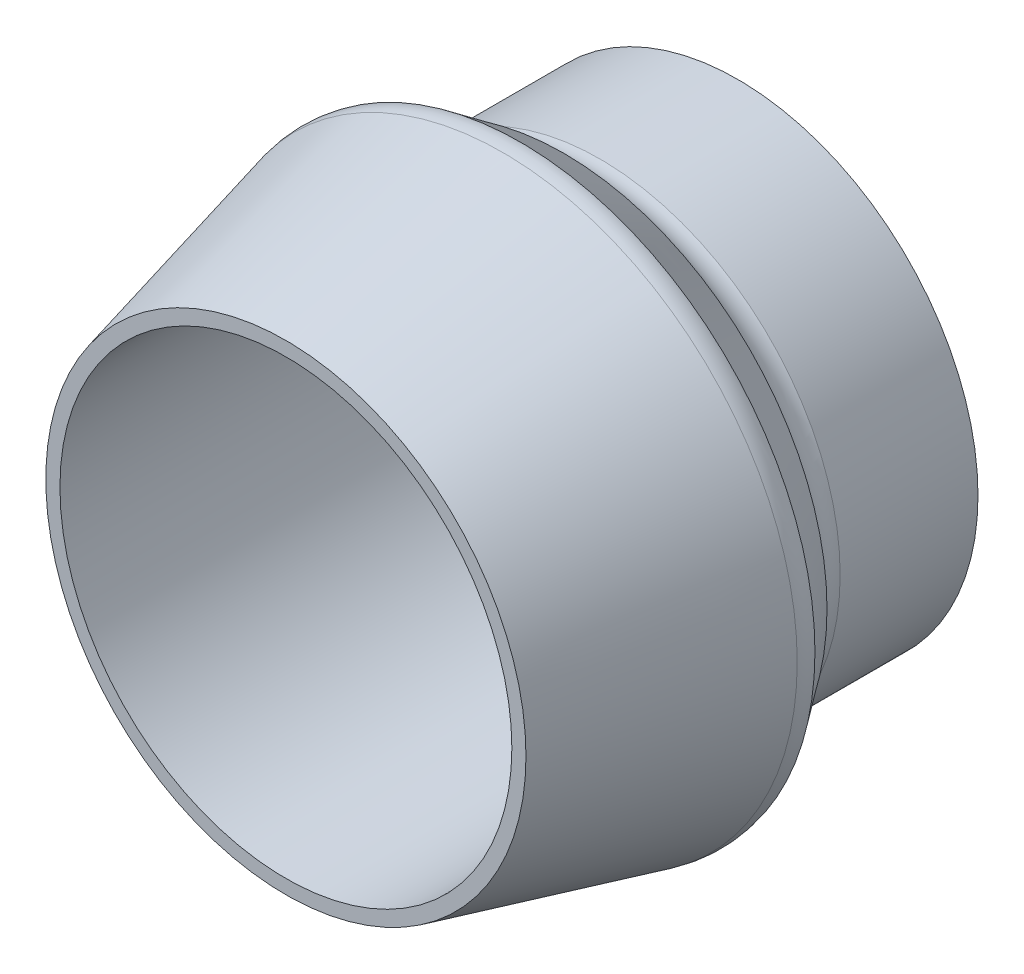
ISO-10303-21;
HEADER;
FILE_DESCRIPTION(('STEP AP214'),'2;1');
FILE_NAME('part.step','',(''),(''),'','','');
FILE_SCHEMA(('AUTOMOTIVE_DESIGN { 1 0 10303 214 1 1 1 1 }'));
ENDSEC;
DATA;
#1=APPLICATION_CONTEXT('core data for automotive mechanical design processes');
#2=APPLICATION_PROTOCOL_DEFINITION('international standard','automotive_design',2000,#1);
#3=PRODUCT_CONTEXT('',#1,'mechanical');
#4=PRODUCT('Part','Part','',(#3));
#5=PRODUCT_RELATED_PRODUCT_CATEGORY('part','',(#4));
#6=PRODUCT_DEFINITION_FORMATION('','',#4);
#7=PRODUCT_DEFINITION_CONTEXT('part definition',#1,'design');
#8=PRODUCT_DEFINITION('design','',#6,#7);
#9=PRODUCT_DEFINITION_SHAPE('','',#8);
#10=(LENGTH_UNIT() NAMED_UNIT(*) SI_UNIT(.MILLI.,.METRE.));
#11=(NAMED_UNIT(*) PLANE_ANGLE_UNIT() SI_UNIT($,.RADIAN.));
#12=(NAMED_UNIT(*) SI_UNIT($,.STERADIAN.) SOLID_ANGLE_UNIT());
#13=UNCERTAINTY_MEASURE_WITH_UNIT(LENGTH_MEASURE(1.E-05),#10,'distance_accuracy_value','');
#14=(GEOMETRIC_REPRESENTATION_CONTEXT(3) GLOBAL_UNCERTAINTY_ASSIGNED_CONTEXT((#13)) GLOBAL_UNIT_ASSIGNED_CONTEXT((#10,
#11,#12)) REPRESENTATION_CONTEXT('',''));
#15=CARTESIAN_POINT('',(0.,0.,0.));
#16=DIRECTION('',(0.,0.,1.));
#17=DIRECTION('',(1.,0.,0.));
#18=AXIS2_PLACEMENT_3D('',#15,#16,#17);
#19=CARTESIAN_POINT('',(0.,3.37457217841307,33.65));
#20=DIRECTION('',(0.,0.,-1.));
#21=DIRECTION('',(-1.,0.,0.));
#22=AXIS2_PLACEMENT_3D('',#19,#20,#21);
#23=PLANE('',#22);
#24=CARTESIAN_POINT('',(0.,0.,33.65));
#25=DIRECTION('',(0.,0.,1.));
#26=DIRECTION('',(1.,0.,0.));
#27=AXIS2_PLACEMENT_3D('',#24,#25,#26);
#28=CIRCLE('',#27,3.175);
#29=CARTESIAN_POINT('',(3.175,0.,33.65));
#30=VERTEX_POINT('',#29);
#31=EDGE_CURVE('E57',#30,#30,#28,.T.);
#32=ORIENTED_EDGE('',*,*,#31,.T.);
#33=EDGE_LOOP('',(#32));
#34=FACE_BOUND('',#33,.T.);
#35=CARTESIAN_POINT('',(0.,0.,33.65));
#36=DIRECTION('',(0.,0.,1.));
#37=DIRECTION('',(1.,0.,0.));
#38=AXIS2_PLACEMENT_3D('',#35,#36,#37);
#39=CIRCLE('',#38,3.37457217841307);
#40=CARTESIAN_POINT('',(3.37457217841307,0.,33.65));
#41=VERTEX_POINT('',#40);
#42=EDGE_CURVE('E10',#41,#41,#39,.T.);
#43=ORIENTED_EDGE('',*,*,#42,.F.);
#44=EDGE_LOOP('',(#43));
#45=FACE_BOUND('',#44,.T.);
#46=ADVANCED_FACE('F29',(#34,#45),#23,.T.);
#47=CARTESIAN_POINT('',(0.,0.,40.));
#48=DIRECTION('',(0.,0.,1.));
#49=DIRECTION('',(1.,0.,0.));
#50=AXIS2_PLACEMENT_3D('',#47,#48,#49);
#51=CYLINDRICAL_SURFACE('',#50,3.37457217841306);
#52=ORIENTED_EDGE('',*,*,#42,.T.);
#53=EDGE_LOOP('',(#52));
#54=FACE_BOUND('',#53,.T.);
#55=CARTESIAN_POINT('',(0.,0.,35.58663158984));
#56=DIRECTION('',(0.,0.,1.));
#57=DIRECTION('',(1.,0.,0.));
#58=AXIS2_PLACEMENT_3D('',#55,#56,#57);
#59=CIRCLE('',#58,3.37457217841306);
#60=CARTESIAN_POINT('',(3.37457217841306,0.,35.58663158984));
#61=VERTEX_POINT('',#60);
#62=EDGE_CURVE('E35',#61,#61,#59,.T.);
#63=ORIENTED_EDGE('',*,*,#62,.F.);
#64=EDGE_LOOP('',(#63));
#65=FACE_BOUND('',#64,.T.);
#66=ADVANCED_FACE('F75',(#54,#65),#51,.T.);
#67=CARTESIAN_POINT('',(0.,0.,35.6790206423921));
#68=DIRECTION('',(0.,0.,1.));
#69=DIRECTION('',(1.,0.,0.));
#70=AXIS2_PLACEMENT_3D('',#67,#68,#69);
#71=TOROIDAL_SURFACE('',#70,3.78771307938937,0.423345179600507);
#72=ORIENTED_EDGE('',*,*,#62,.T.);
#73=EDGE_LOOP('',(#72));
#74=FACE_BOUND('',#73,.T.);
#75=CARTESIAN_POINT('',(0.,0.,36.0921615433684));
#76=DIRECTION('',(0.,0.,1.));
#77=DIRECTION('',(1.,0.,0.));
#78=AXIS2_PLACEMENT_3D('',#75,#76,#77);
#79=CIRCLE('',#78,3.69532402683727);
#80=CARTESIAN_POINT('',(3.69532402683727,0.,36.0921615433684));
#81=VERTEX_POINT('',#80);
#82=EDGE_CURVE('E39',#81,#81,#79,.T.);
#83=ORIENTED_EDGE('',*,*,#82,.F.);
#84=EDGE_LOOP('',(#83));
#85=FACE_BOUND('',#84,.T.);
#86=ADVANCED_FACE('F79',(#74,#85),#71,.F.);
#87=CARTESIAN_POINT('',(0.,0.,36.6995702759276));
#88=DIRECTION('',(0.,0.,1.));
#89=DIRECTION('',(1.,0.,0.));
#90=AXIS2_PLACEMENT_3D('',#87,#88,#89);
#91=CONICAL_SURFACE('',#90,4.1333601343469,0.624783590406103);
#92=ORIENTED_EDGE('',*,*,#82,.T.);
#93=EDGE_LOOP('',(#92));
#94=FACE_BOUND('',#93,.T.);
#95=CARTESIAN_POINT('',(0.,0.,36.6995702759276));
#96=DIRECTION('',(0.,0.,1.));
#97=DIRECTION('',(1.,0.,0.));
#98=AXIS2_PLACEMENT_3D('',#95,#96,#97);
#99=CIRCLE('',#98,4.1333601343469);
#100=CARTESIAN_POINT('',(4.1333601343469,0.,36.6995702759276));
#101=VERTEX_POINT('',#100);
#102=EDGE_CURVE('E43',#101,#101,#99,.T.);
#103=ORIENTED_EDGE('',*,*,#102,.F.);
#104=EDGE_LOOP('',(#103));
#105=FACE_BOUND('',#104,.T.);
#106=ADVANCED_FACE('F83',(#94,#105),#91,.T.);
#107=CARTESIAN_POINT('',(0.,0.,36.8297645132994));
#108=DIRECTION('',(0.,0.,1.));
#109=DIRECTION('',(1.,0.,0.));
#110=AXIS2_PLACEMENT_3D('',#107,#108,#109);
#111=TOROIDAL_SURFACE('',#110,3.65060816847295,0.499999999999999);
#112=CARTESIAN_POINT('',(0.,0.,36.9510323258176));
#113=DIRECTION('',(0.,0.,1.));
#114=DIRECTION('',(1.,0.,0.));
#115=AXIS2_PLACEMENT_3D('',#112,#113,#114);
#116=CIRCLE('',#115,4.13567941854561);
#117=CARTESIAN_POINT('',(4.13567941854561,0.,36.9510323258176));
#118=VERTEX_POINT('',#117);
#119=EDGE_CURVE('E48',#118,#118,#116,.T.);
#120=ORIENTED_EDGE('',*,*,#119,.F.);
#121=EDGE_LOOP('',(#120));
#122=FACE_BOUND('',#121,.T.);
#123=ORIENTED_EDGE('',*,*,#102,.T.);
#124=EDGE_LOOP('',(#123));
#125=FACE_BOUND('',#124,.T.);
#126=ADVANCED_FACE('F89',(#122,#125),#111,.T.);
#127=CARTESIAN_POINT('',(0.,0.,40.));
#128=DIRECTION('',(0.,0.,-1.));
#129=DIRECTION('',(-1.,0.,0.));
#130=AXIS2_PLACEMENT_3D('',#127,#128,#129);
#131=CONICAL_SURFACE('',#130,3.3734375,0.244978663126864);
#132=ORIENTED_EDGE('',*,*,#119,.T.);
#133=EDGE_LOOP('',(#132));
#134=FACE_BOUND('',#133,.T.);
#135=CARTESIAN_POINT('',(0.,0.,40.));
#136=DIRECTION('',(0.,0.,1.));
#137=DIRECTION('',(1.,0.,0.));
#138=AXIS2_PLACEMENT_3D('',#135,#136,#137);
#139=CIRCLE('',#138,3.3734375);
#140=CARTESIAN_POINT('',(3.3734375,0.,40.));
#141=VERTEX_POINT('',#140);
#142=EDGE_CURVE('E51',#141,#141,#139,.T.);
#143=ORIENTED_EDGE('',*,*,#142,.F.);
#144=EDGE_LOOP('',(#143));
#145=FACE_BOUND('',#144,.T.);
#146=ADVANCED_FACE('F71',(#134,#145),#131,.T.);
#147=CARTESIAN_POINT('',(0.,3.175,40.));
#148=DIRECTION('',(0.,0.,1.));
#149=DIRECTION('',(1.,0.,0.));
#150=AXIS2_PLACEMENT_3D('',#147,#148,#149);
#151=PLANE('',#150);
#152=ORIENTED_EDGE('',*,*,#142,.T.);
#153=EDGE_LOOP('',(#152));
#154=FACE_BOUND('',#153,.T.);
#155=CARTESIAN_POINT('',(0.,0.,40.));
#156=DIRECTION('',(0.,0.,1.));
#157=DIRECTION('',(1.,0.,0.));
#158=AXIS2_PLACEMENT_3D('',#155,#156,#157);
#159=CIRCLE('',#158,3.175);
#160=CARTESIAN_POINT('',(3.175,0.,40.));
#161=VERTEX_POINT('',#160);
#162=EDGE_CURVE('E54',#161,#161,#159,.T.);
#163=ORIENTED_EDGE('',*,*,#162,.F.);
#164=EDGE_LOOP('',(#163));
#165=FACE_BOUND('',#164,.T.);
#166=ADVANCED_FACE('F65',(#154,#165),#151,.T.);
#167=CARTESIAN_POINT('',(0.,0.,40.));
#168=DIRECTION('',(0.,0.,1.));
#169=DIRECTION('',(1.,0.,0.));
#170=AXIS2_PLACEMENT_3D('',#167,#168,#169);
#171=CYLINDRICAL_SURFACE('',#170,3.175);
#172=ORIENTED_EDGE('',*,*,#162,.T.);
#173=EDGE_LOOP('',(#172));
#174=FACE_BOUND('',#173,.T.);
#175=ORIENTED_EDGE('',*,*,#31,.F.);
#176=EDGE_LOOP('',(#175));
#177=FACE_BOUND('',#176,.T.);
#178=ADVANCED_FACE('F63',(#174,#177),#171,.F.);
#179=CLOSED_SHELL('',(#46,#66,#86,#106,#126,#146,#166,#178));
#180=MANIFOLD_SOLID_BREP('B2',#179);
#181=ADVANCED_BREP_SHAPE_REPRESENTATION('',(#18,#180),#14);
#182=SHAPE_DEFINITION_REPRESENTATION(#9,#181);
ENDSEC;
END-ISO-10303-21;
